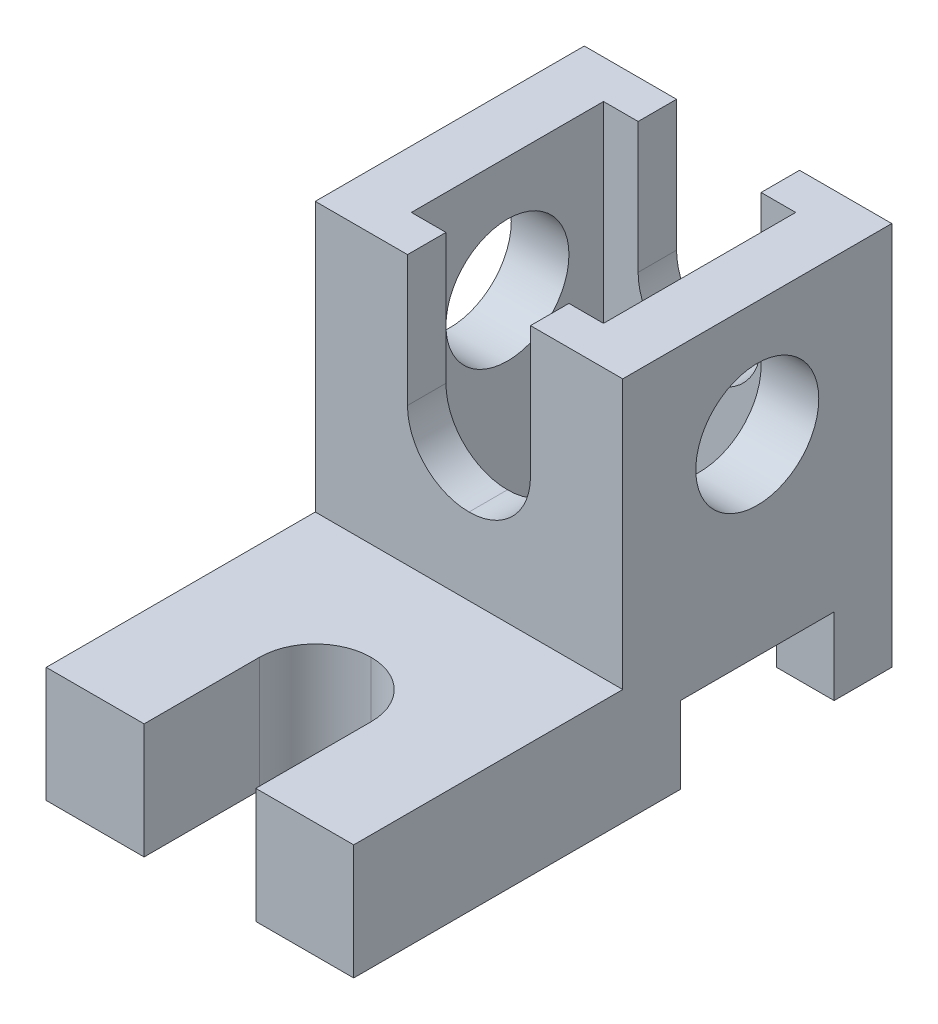
ISO-10303-21;
HEADER;
FILE_DESCRIPTION(('STEP AP214'),'2;1');
FILE_NAME('part.step','',(''),(''),'','','');
FILE_SCHEMA(('AUTOMOTIVE_DESIGN { 1 0 10303 214 1 1 1 1 }'));
ENDSEC;
DATA;
#1=APPLICATION_CONTEXT('core data for automotive mechanical design processes');
#2=APPLICATION_PROTOCOL_DEFINITION('international standard','automotive_design',2000,#1);
#3=PRODUCT_CONTEXT('',#1,'mechanical');
#4=PRODUCT('Part','Part','',(#3));
#5=PRODUCT_RELATED_PRODUCT_CATEGORY('part','',(#4));
#6=PRODUCT_DEFINITION_FORMATION('','',#4);
#7=PRODUCT_DEFINITION_CONTEXT('part definition',#1,'design');
#8=PRODUCT_DEFINITION('design','',#6,#7);
#9=PRODUCT_DEFINITION_SHAPE('','',#8);
#10=(LENGTH_UNIT() NAMED_UNIT(*) SI_UNIT(.MILLI.,.METRE.));
#11=(NAMED_UNIT(*) PLANE_ANGLE_UNIT() SI_UNIT($,.RADIAN.));
#12=(NAMED_UNIT(*) SI_UNIT($,.STERADIAN.) SOLID_ANGLE_UNIT());
#13=UNCERTAINTY_MEASURE_WITH_UNIT(LENGTH_MEASURE(1.E-05),#10,'distance_accuracy_value','');
#14=(GEOMETRIC_REPRESENTATION_CONTEXT(3) GLOBAL_UNCERTAINTY_ASSIGNED_CONTEXT((#13)) GLOBAL_UNIT_ASSIGNED_CONTEXT((#10,
#11,#12)) REPRESENTATION_CONTEXT('',''));
#15=CARTESIAN_POINT('',(0.,0.,0.));
#16=DIRECTION('',(0.,0.,1.));
#17=DIRECTION('',(1.,0.,0.));
#18=AXIS2_PLACEMENT_3D('',#15,#16,#17);
#19=CARTESIAN_POINT('',(-40.,30.,105.));
#20=DIRECTION('',(0.,0.,1.));
#21=DIRECTION('',(1.,0.,0.));
#22=AXIS2_PLACEMENT_3D('',#19,#20,#21);
#23=PLANE('',#22);
#24=DIRECTION('',(0.,1.,0.));
#25=VECTOR('',#24,1.);
#26=CARTESIAN_POINT('',(-14.53,0.,105.));
#27=LINE('',#26,#25);
#28=CARTESIAN_POINT('',(-14.53,0.,105.));
#29=VERTEX_POINT('',#28);
#30=CARTESIAN_POINT('',(-14.53,30.,105.));
#31=VERTEX_POINT('',#30);
#32=EDGE_CURVE('E273',#29,#31,#27,.T.);
#33=ORIENTED_EDGE('',*,*,#32,.T.);
#34=DIRECTION('',(1.,0.,0.));
#35=VECTOR('',#34,1.);
#36=CARTESIAN_POINT('',(-40.,30.,105.));
#37=LINE('',#36,#35);
#38=CARTESIAN_POINT('',(-40.,30.,105.));
#39=VERTEX_POINT('',#38);
#40=EDGE_CURVE('E312',#39,#31,#37,.T.);
#41=ORIENTED_EDGE('',*,*,#40,.F.);
#42=DIRECTION('',(0.,-1.,0.));
#43=VECTOR('',#42,1.);
#44=CARTESIAN_POINT('',(-40.,30.,105.));
#45=LINE('',#44,#43);
#46=CARTESIAN_POINT('',(-40.,0.,105.));
#47=VERTEX_POINT('',#46);
#48=EDGE_CURVE('E283',#39,#47,#45,.T.);
#49=ORIENTED_EDGE('',*,*,#48,.T.);
#50=DIRECTION('',(1.,0.,0.));
#51=VECTOR('',#50,1.);
#52=CARTESIAN_POINT('',(-40.,0.,105.));
#53=LINE('',#52,#51);
#54=EDGE_CURVE('E264',#47,#29,#53,.T.);
#55=ORIENTED_EDGE('',*,*,#54,.T.);
#56=EDGE_LOOP('',(#33,#41,#49,#55));
#57=FACE_BOUND('',#56,.T.);
#58=ADVANCED_FACE('F45',(#57),#23,.T.);
#59=CARTESIAN_POINT('',(-40.,100.,-35.));
#60=DIRECTION('',(0.,1.,0.));
#61=DIRECTION('',(0.,0.,1.));
#62=AXIS2_PLACEMENT_3D('',#59,#60,#61);
#63=PLANE('',#62);
#64=DIRECTION('',(0.,0.,1.));
#65=VECTOR('',#64,1.);
#66=CARTESIAN_POINT('',(-16.,100.,-35.));
#67=LINE('',#66,#65);
#68=CARTESIAN_POINT('',(-16.,100.,-35.));
#69=VERTEX_POINT('',#68);
#70=CARTESIAN_POINT('',(-16.,100.,-25.));
#71=VERTEX_POINT('',#70);
#72=EDGE_CURVE('E586',#69,#71,#67,.T.);
#73=ORIENTED_EDGE('',*,*,#72,.F.);
#74=DIRECTION('',(1.,0.,0.));
#75=VECTOR('',#74,1.);
#76=CARTESIAN_POINT('',(-40.,100.,-35.));
#77=LINE('',#76,#75);
#78=CARTESIAN_POINT('',(-40.,100.,-35.));
#79=VERTEX_POINT('',#78);
#80=EDGE_CURVE('E389',#79,#69,#77,.T.);
#81=ORIENTED_EDGE('',*,*,#80,.F.);
#82=DIRECTION('',(0.,0.,1.));
#83=VECTOR('',#82,1.);
#84=CARTESIAN_POINT('',(-40.,100.,-35.));
#85=LINE('',#84,#83);
#86=CARTESIAN_POINT('',(-40.,100.,35.));
#87=VERTEX_POINT('',#86);
#88=EDGE_CURVE('E452',#79,#87,#85,.T.);
#89=ORIENTED_EDGE('',*,*,#88,.T.);
#90=DIRECTION('',(1.,0.,0.));
#91=VECTOR('',#90,1.);
#92=CARTESIAN_POINT('',(-40.,100.,35.));
#93=LINE('',#92,#91);
#94=CARTESIAN_POINT('',(-16.,100.,35.));
#95=VERTEX_POINT('',#94);
#96=EDGE_CURVE('E382',#87,#95,#93,.T.);
#97=ORIENTED_EDGE('',*,*,#96,.T.);
#98=CARTESIAN_POINT('',(-16.,100.,25.));
#99=VERTEX_POINT('',#98);
#100=EDGE_CURVE('E591',#99,#95,#67,.T.);
#101=ORIENTED_EDGE('',*,*,#100,.F.);
#102=DIRECTION('',(1.,0.,0.));
#103=VECTOR('',#102,1.);
#104=CARTESIAN_POINT('',(-25.,100.,25.));
#105=LINE('',#104,#103);
#106=CARTESIAN_POINT('',(-25.,100.,25.));
#107=VERTEX_POINT('',#106);
#108=EDGE_CURVE('E547',#107,#99,#105,.T.);
#109=ORIENTED_EDGE('',*,*,#108,.F.);
#110=DIRECTION('',(0.,0.,1.));
#111=VECTOR('',#110,1.);
#112=CARTESIAN_POINT('',(-25.,100.,-25.));
#113=LINE('',#112,#111);
#114=CARTESIAN_POINT('',(-25.,100.,-25.));
#115=VERTEX_POINT('',#114);
#116=EDGE_CURVE('E553',#115,#107,#113,.T.);
#117=ORIENTED_EDGE('',*,*,#116,.F.);
#118=DIRECTION('',(-1.,0.,0.));
#119=VECTOR('',#118,1.);
#120=CARTESIAN_POINT('',(-25.,100.,-25.));
#121=LINE('',#120,#119);
#122=EDGE_CURVE('E561',#71,#115,#121,.T.);
#123=ORIENTED_EDGE('',*,*,#122,.F.);
#124=EDGE_LOOP('',(#73,#81,#89,#97,#101,#109,#117,#123));
#125=FACE_BOUND('',#124,.T.);
#126=ADVANCED_FACE('F641',(#125),#63,.T.);
#127=CARTESIAN_POINT('',(-40.,20.,-20.));
#128=DIRECTION('',(0.,0.,1.));
#129=DIRECTION('',(1.,0.,0.));
#130=AXIS2_PLACEMENT_3D('',#127,#128,#129);
#131=PLANE('',#130);
#132=DIRECTION('',(0.,1.,0.));
#133=VECTOR('',#132,1.);
#134=CARTESIAN_POINT('',(25.,20.,-20.));
#135=LINE('',#134,#133);
#136=CARTESIAN_POINT('',(25.,0.,-20.));
#137=VERTEX_POINT('',#136);
#138=CARTESIAN_POINT('',(25.,20.,-20.));
#139=VERTEX_POINT('',#138);
#140=EDGE_CURVE('E517',#137,#139,#135,.T.);
#141=ORIENTED_EDGE('',*,*,#140,.F.);
#142=DIRECTION('',(1.,0.,0.));
#143=VECTOR('',#142,1.);
#144=CARTESIAN_POINT('',(-40.,0.,-20.));
#145=LINE('',#144,#143);
#146=CARTESIAN_POINT('',(40.,0.,-20.));
#147=VERTEX_POINT('',#146);
#148=EDGE_CURVE('E401',#137,#147,#145,.T.);
#149=ORIENTED_EDGE('',*,*,#148,.T.);
#150=DIRECTION('',(0.,-1.,0.));
#151=VECTOR('',#150,1.);
#152=CARTESIAN_POINT('',(40.,20.,-20.));
#153=LINE('',#152,#151);
#154=CARTESIAN_POINT('',(40.,20.,-20.));
#155=VERTEX_POINT('',#154);
#156=EDGE_CURVE('E493',#155,#147,#153,.T.);
#157=ORIENTED_EDGE('',*,*,#156,.F.);
#158=DIRECTION('',(1.,0.,0.));
#159=VECTOR('',#158,1.);
#160=CARTESIAN_POINT('',(-40.,20.,-20.));
#161=LINE('',#160,#159);
#162=EDGE_CURVE('E407',#139,#155,#161,.T.);
#163=ORIENTED_EDGE('',*,*,#162,.F.);
#164=EDGE_LOOP('',(#141,#149,#157,#163));
#165=FACE_BOUND('',#164,.T.);
#166=ADVANCED_FACE('F658',(#165),#131,.T.);
#167=CARTESIAN_POINT('',(-40.,20.,20.));
#168=DIRECTION('',(0.,-1.,0.));
#169=DIRECTION('',(0.,0.,-1.));
#170=AXIS2_PLACEMENT_3D('',#167,#168,#169);
#171=PLANE('',#170);
#172=DIRECTION('',(0.,0.,1.));
#173=VECTOR('',#172,1.);
#174=CARTESIAN_POINT('',(25.,20.,20.));
#175=LINE('',#174,#173);
#176=CARTESIAN_POINT('',(25.,20.,20.));
#177=VERTEX_POINT('',#176);
#178=EDGE_CURVE('E520',#139,#177,#175,.T.);
#179=ORIENTED_EDGE('',*,*,#178,.F.);
#180=ORIENTED_EDGE('',*,*,#162,.T.);
#181=DIRECTION('',(0.,0.,-1.));
#182=VECTOR('',#181,1.);
#183=CARTESIAN_POINT('',(40.,20.,20.));
#184=LINE('',#183,#182);
#185=CARTESIAN_POINT('',(40.,20.,20.));
#186=VERTEX_POINT('',#185);
#187=EDGE_CURVE('E497',#186,#155,#184,.T.);
#188=ORIENTED_EDGE('',*,*,#187,.F.);
#189=DIRECTION('',(1.,0.,0.));
#190=VECTOR('',#189,1.);
#191=CARTESIAN_POINT('',(-40.,20.,20.));
#192=LINE('',#191,#190);
#193=EDGE_CURVE('E413',#177,#186,#192,.T.);
#194=ORIENTED_EDGE('',*,*,#193,.F.);
#195=EDGE_LOOP('',(#179,#180,#188,#194));
#196=FACE_BOUND('',#195,.T.);
#197=ADVANCED_FACE('F725',(#196),#171,.T.);
#198=CARTESIAN_POINT('',(-40.,0.,20.));
#199=DIRECTION('',(0.,0.,-1.));
#200=DIRECTION('',(-1.,0.,0.));
#201=AXIS2_PLACEMENT_3D('',#198,#199,#200);
#202=PLANE('',#201);
#203=DIRECTION('',(0.,-1.,0.));
#204=VECTOR('',#203,1.);
#205=CARTESIAN_POINT('',(25.,0.,20.));
#206=LINE('',#205,#204);
#207=CARTESIAN_POINT('',(25.,0.,20.));
#208=VERTEX_POINT('',#207);
#209=EDGE_CURVE('E305',#177,#208,#206,.T.);
#210=ORIENTED_EDGE('',*,*,#209,.F.);
#211=ORIENTED_EDGE('',*,*,#193,.T.);
#212=DIRECTION('',(0.,1.,0.));
#213=VECTOR('',#212,1.);
#214=CARTESIAN_POINT('',(40.,0.,20.));
#215=LINE('',#214,#213);
#216=CARTESIAN_POINT('',(40.,0.,20.));
#217=VERTEX_POINT('',#216);
#218=EDGE_CURVE('E501',#217,#186,#215,.T.);
#219=ORIENTED_EDGE('',*,*,#218,.F.);
#220=DIRECTION('',(1.,0.,0.));
#221=VECTOR('',#220,1.);
#222=CARTESIAN_POINT('',(-40.,0.,20.));
#223=LINE('',#222,#221);
#224=EDGE_CURVE('E285',#208,#217,#223,.T.);
#225=ORIENTED_EDGE('',*,*,#224,.F.);
#226=EDGE_LOOP('',(#210,#211,#219,#225));
#227=FACE_BOUND('',#226,.T.);
#228=ADVANCED_FACE('F717',(#227),#202,.T.);
#229=CARTESIAN_POINT('',(-40.,70.,0.));
#230=DIRECTION('',(1.,0.,0.));
#231=DIRECTION('',(0.,0.,-1.));
#232=AXIS2_PLACEMENT_3D('',#229,#230,#231);
#233=CYLINDRICAL_SURFACE('',#232,16.);
#234=CARTESIAN_POINT('',(25.,70.,0.));
#235=DIRECTION('',(1.,0.,0.));
#236=DIRECTION('',(0.,0.,-1.));
#237=AXIS2_PLACEMENT_3D('',#234,#235,#236);
#238=CIRCLE('',#237,16.);
#239=CARTESIAN_POINT('',(25.,70.,-16.));
#240=VERTEX_POINT('',#239);
#241=EDGE_CURVE('E301',#240,#240,#238,.F.);
#242=ORIENTED_EDGE('',*,*,#241,.T.);
#243=EDGE_LOOP('',(#242));
#244=FACE_BOUND('',#243,.T.);
#245=CARTESIAN_POINT('',(40.,70.,0.));
#246=DIRECTION('',(1.,0.,0.));
#247=DIRECTION('',(0.,0.,-1.));
#248=AXIS2_PLACEMENT_3D('',#245,#246,#247);
#249=CIRCLE('',#248,16.);
#250=CARTESIAN_POINT('',(40.,70.,-16.));
#251=VERTEX_POINT('',#250);
#252=EDGE_CURVE('E513',#251,#251,#249,.T.);
#253=ORIENTED_EDGE('',*,*,#252,.T.);
#254=EDGE_LOOP('',(#253));
#255=FACE_BOUND('',#254,.T.);
#256=ADVANCED_FACE('F711',(#244,#255),#233,.F.);
#257=DIRECTION('',(0.,1.,0.));
#258=VECTOR('',#257,1.);
#259=CARTESIAN_POINT('',(14.53,0.,105.));
#260=LINE('',#259,#258);
#261=CARTESIAN_POINT('',(14.53,0.,105.));
#262=VERTEX_POINT('',#261);
#263=CARTESIAN_POINT('',(14.53,30.,105.));
#264=VERTEX_POINT('',#263);
#265=EDGE_CURVE('E279',#262,#264,#260,.T.);
#266=ORIENTED_EDGE('',*,*,#265,.F.);
#267=CARTESIAN_POINT('',(40.,0.,105.));
#268=VERTEX_POINT('',#267);
#269=EDGE_CURVE('E286',#262,#268,#53,.T.);
#270=ORIENTED_EDGE('',*,*,#269,.T.);
#271=DIRECTION('',(0.,-1.,0.));
#272=VECTOR('',#271,1.);
#273=CARTESIAN_POINT('',(40.,30.,105.));
#274=LINE('',#273,#272);
#275=CARTESIAN_POINT('',(40.,30.,105.));
#276=VERTEX_POINT('',#275);
#277=EDGE_CURVE('E509',#276,#268,#274,.T.);
#278=ORIENTED_EDGE('',*,*,#277,.F.);
#279=EDGE_CURVE('E377',#264,#276,#37,.T.);
#280=ORIENTED_EDGE('',*,*,#279,.F.);
#281=EDGE_LOOP('',(#266,#270,#278,#280));
#282=FACE_BOUND('',#281,.T.);
#283=ADVANCED_FACE('F626',(#282),#23,.T.);
#284=CARTESIAN_POINT('',(-40.,30.,35.));
#285=DIRECTION('',(0.,1.,0.));
#286=DIRECTION('',(0.,0.,1.));
#287=AXIS2_PLACEMENT_3D('',#284,#285,#286);
#288=PLANE('',#287);
#289=DIRECTION('',(0.,0.,1.));
#290=VECTOR('',#289,1.);
#291=CARTESIAN_POINT('',(-14.53,30.,105.));
#292=LINE('',#291,#290);
#293=CARTESIAN_POINT('',(-14.53,30.,75.));
#294=VERTEX_POINT('',#293);
#295=EDGE_CURVE('E275',#294,#31,#292,.T.);
#296=ORIENTED_EDGE('',*,*,#295,.F.);
#297=CARTESIAN_POINT('',(0.,30.,75.));
#298=DIRECTION('',(0.,1.,0.));
#299=DIRECTION('',(0.,0.,1.));
#300=AXIS2_PLACEMENT_3D('',#297,#298,#299);
#301=CIRCLE('',#300,14.53);
#302=CARTESIAN_POINT('',(0.,30.,60.47));
#303=VERTEX_POINT('',#302);
#304=EDGE_CURVE('E55',#294,#303,#301,.F.);
#305=ORIENTED_EDGE('',*,*,#304,.T.);
#306=CARTESIAN_POINT('',(0.,30.,75.));
#307=DIRECTION('',(0.,1.,0.));
#308=DIRECTION('',(0.,0.,1.));
#309=AXIS2_PLACEMENT_3D('',#306,#307,#308);
#310=CIRCLE('',#309,14.53);
#311=CARTESIAN_POINT('',(14.53,30.,75.));
#312=VERTEX_POINT('',#311);
#313=EDGE_CURVE('E369',#303,#312,#310,.F.);
#314=ORIENTED_EDGE('',*,*,#313,.T.);
#315=DIRECTION('',(0.,0.,-1.));
#316=VECTOR('',#315,1.);
#317=CARTESIAN_POINT('',(14.53,30.,105.));
#318=LINE('',#317,#316);
#319=EDGE_CURVE('E270',#264,#312,#318,.T.);
#320=ORIENTED_EDGE('',*,*,#319,.F.);
#321=ORIENTED_EDGE('',*,*,#279,.T.);
#322=DIRECTION('',(0.,0.,1.));
#323=VECTOR('',#322,1.);
#324=CARTESIAN_POINT('',(40.,30.,35.));
#325=LINE('',#324,#323);
#326=CARTESIAN_POINT('',(40.,30.,35.));
#327=VERTEX_POINT('',#326);
#328=EDGE_CURVE('E471',#327,#276,#325,.T.);
#329=ORIENTED_EDGE('',*,*,#328,.F.);
#330=DIRECTION('',(1.,0.,0.));
#331=VECTOR('',#330,1.);
#332=CARTESIAN_POINT('',(-40.,30.,35.));
#333=LINE('',#332,#331);
#334=CARTESIAN_POINT('',(-40.,30.,35.));
#335=VERTEX_POINT('',#334);
#336=EDGE_CURVE('E380',#335,#327,#333,.T.);
#337=ORIENTED_EDGE('',*,*,#336,.F.);
#338=DIRECTION('',(0.,0.,1.));
#339=VECTOR('',#338,1.);
#340=CARTESIAN_POINT('',(-40.,30.,35.));
#341=LINE('',#340,#339);
#342=EDGE_CURVE('E292',#335,#39,#341,.T.);
#343=ORIENTED_EDGE('',*,*,#342,.T.);
#344=ORIENTED_EDGE('',*,*,#40,.T.);
#345=EDGE_LOOP('',(#296,#305,#314,#320,#321,#329,#337,#343,#344));
#346=FACE_BOUND('',#345,.T.);
#347=ADVANCED_FACE('F463',(#346),#288,.T.);
#348=CARTESIAN_POINT('',(-40.,100.,35.));
#349=DIRECTION('',(0.,0.,1.));
#350=DIRECTION('',(0.,-1.,0.));
#351=AXIS2_PLACEMENT_3D('',#348,#349,#350);
#352=PLANE('',#351);
#353=DIRECTION('',(0.,-1.,0.));
#354=VECTOR('',#353,1.);
#355=CARTESIAN_POINT('',(-16.,100.,35.));
#356=LINE('',#355,#354);
#357=CARTESIAN_POINT('',(-16.,66.,35.));
#358=VERTEX_POINT('',#357);
#359=EDGE_CURVE('E358',#95,#358,#356,.T.);
#360=ORIENTED_EDGE('',*,*,#359,.F.);
#361=ORIENTED_EDGE('',*,*,#96,.F.);
#362=DIRECTION('',(0.,-1.,0.));
#363=VECTOR('',#362,1.);
#364=CARTESIAN_POINT('',(-40.,100.,35.));
#365=LINE('',#364,#363);
#366=EDGE_CURVE('E456',#87,#335,#365,.T.);
#367=ORIENTED_EDGE('',*,*,#366,.T.);
#368=ORIENTED_EDGE('',*,*,#336,.T.);
#369=DIRECTION('',(0.,-1.,0.));
#370=VECTOR('',#369,1.);
#371=CARTESIAN_POINT('',(40.,100.,35.));
#372=LINE('',#371,#370);
#373=CARTESIAN_POINT('',(40.,100.,35.));
#374=VERTEX_POINT('',#373);
#375=EDGE_CURVE('E477',#374,#327,#372,.T.);
#376=ORIENTED_EDGE('',*,*,#375,.F.);
#377=CARTESIAN_POINT('',(16.,100.,35.));
#378=VERTEX_POINT('',#377);
#379=EDGE_CURVE('E386',#378,#374,#93,.T.);
#380=ORIENTED_EDGE('',*,*,#379,.F.);
#381=DIRECTION('',(0.,1.,0.));
#382=VECTOR('',#381,1.);
#383=CARTESIAN_POINT('',(16.,100.,35.));
#384=LINE('',#383,#382);
#385=CARTESIAN_POINT('',(16.,66.,35.));
#386=VERTEX_POINT('',#385);
#387=EDGE_CURVE('E596',#386,#378,#384,.T.);
#388=ORIENTED_EDGE('',*,*,#387,.F.);
#389=CARTESIAN_POINT('',(0.,66.,35.));
#390=DIRECTION('',(0.,0.,1.));
#391=DIRECTION('',(0.,-1.,0.));
#392=AXIS2_PLACEMENT_3D('',#389,#390,#391);
#393=CIRCLE('',#392,16.);
#394=CARTESIAN_POINT('',(0.,50.,35.));
#395=VERTEX_POINT('',#394);
#396=EDGE_CURVE('E341',#386,#395,#393,.F.);
#397=ORIENTED_EDGE('',*,*,#396,.T.);
#398=CARTESIAN_POINT('',(0.,66.,35.));
#399=DIRECTION('',(0.,0.,1.));
#400=DIRECTION('',(0.,-1.,0.));
#401=AXIS2_PLACEMENT_3D('',#398,#399,#400);
#402=CIRCLE('',#401,16.);
#403=EDGE_CURVE('E347',#395,#358,#402,.F.);
#404=ORIENTED_EDGE('',*,*,#403,.T.);
#405=EDGE_LOOP('',(#360,#361,#367,#368,#376,#380,#388,#397,#404));
#406=FACE_BOUND('',#405,.T.);
#407=ADVANCED_FACE('F636',(#406),#352,.T.);
#408=DIRECTION('',(0.,0.,1.));
#409=VECTOR('',#408,1.);
#410=CARTESIAN_POINT('',(16.,100.,-35.));
#411=LINE('',#410,#409);
#412=CARTESIAN_POINT('',(16.,100.,25.));
#413=VERTEX_POINT('',#412);
#414=EDGE_CURVE('E592',#413,#378,#411,.T.);
#415=ORIENTED_EDGE('',*,*,#414,.T.);
#416=ORIENTED_EDGE('',*,*,#379,.T.);
#417=DIRECTION('',(0.,0.,1.));
#418=VECTOR('',#417,1.);
#419=CARTESIAN_POINT('',(40.,100.,-35.));
#420=LINE('',#419,#418);
#421=CARTESIAN_POINT('',(40.,100.,-35.));
#422=VERTEX_POINT('',#421);
#423=EDGE_CURVE('E481',#422,#374,#420,.T.);
#424=ORIENTED_EDGE('',*,*,#423,.F.);
#425=CARTESIAN_POINT('',(16.,100.,-35.));
#426=VERTEX_POINT('',#425);
#427=EDGE_CURVE('E392',#426,#422,#77,.T.);
#428=ORIENTED_EDGE('',*,*,#427,.F.);
#429=CARTESIAN_POINT('',(16.,100.,-25.));
#430=VERTEX_POINT('',#429);
#431=EDGE_CURVE('E587',#426,#430,#411,.T.);
#432=ORIENTED_EDGE('',*,*,#431,.T.);
#433=CARTESIAN_POINT('',(25.,100.,-25.));
#434=VERTEX_POINT('',#433);
#435=EDGE_CURVE('E557',#434,#430,#121,.T.);
#436=ORIENTED_EDGE('',*,*,#435,.F.);
#437=DIRECTION('',(0.,0.,-1.));
#438=VECTOR('',#437,1.);
#439=CARTESIAN_POINT('',(25.,100.,-25.));
#440=LINE('',#439,#438);
#441=CARTESIAN_POINT('',(25.,100.,25.));
#442=VERTEX_POINT('',#441);
#443=EDGE_CURVE('E562',#442,#434,#440,.T.);
#444=ORIENTED_EDGE('',*,*,#443,.F.);
#445=EDGE_CURVE('E552',#413,#442,#105,.T.);
#446=ORIENTED_EDGE('',*,*,#445,.F.);
#447=EDGE_LOOP('',(#415,#416,#424,#428,#432,#436,#444,#446));
#448=FACE_BOUND('',#447,.T.);
#449=ADVANCED_FACE('F670',(#448),#63,.T.);
#450=CARTESIAN_POINT('',(-40.,0.,-35.));
#451=DIRECTION('',(0.,0.,-1.));
#452=DIRECTION('',(-1.,0.,0.));
#453=AXIS2_PLACEMENT_3D('',#450,#451,#452);
#454=PLANE('',#453);
#455=DIRECTION('',(0.,-1.,0.));
#456=VECTOR('',#455,1.);
#457=CARTESIAN_POINT('',(-16.,100.,-35.));
#458=LINE('',#457,#456);
#459=CARTESIAN_POINT('',(-16.,66.,-35.));
#460=VERTEX_POINT('',#459);
#461=EDGE_CURVE('E599',#69,#460,#458,.T.);
#462=ORIENTED_EDGE('',*,*,#461,.T.);
#463=CARTESIAN_POINT('',(0.,66.,-35.));
#464=DIRECTION('',(0.,0.,-1.));
#465=DIRECTION('',(-1.,0.,0.));
#466=AXIS2_PLACEMENT_3D('',#463,#464,#465);
#467=CIRCLE('',#466,16.);
#468=CARTESIAN_POINT('',(0.,50.,-35.));
#469=VERTEX_POINT('',#468);
#470=EDGE_CURVE('E332',#460,#469,#467,.F.);
#471=ORIENTED_EDGE('',*,*,#470,.T.);
#472=CARTESIAN_POINT('',(0.,66.,-35.));
#473=DIRECTION('',(0.,0.,-1.));
#474=DIRECTION('',(-1.,0.,0.));
#475=AXIS2_PLACEMENT_3D('',#472,#473,#474);
#476=CIRCLE('',#475,16.);
#477=CARTESIAN_POINT('',(16.,66.,-35.));
#478=VERTEX_POINT('',#477);
#479=EDGE_CURVE('E338',#469,#478,#476,.F.);
#480=ORIENTED_EDGE('',*,*,#479,.T.);
#481=DIRECTION('',(0.,1.,0.));
#482=VECTOR('',#481,1.);
#483=CARTESIAN_POINT('',(16.,100.,-35.));
#484=LINE('',#483,#482);
#485=EDGE_CURVE('E603',#478,#426,#484,.T.);
#486=ORIENTED_EDGE('',*,*,#485,.T.);
#487=ORIENTED_EDGE('',*,*,#427,.T.);
#488=DIRECTION('',(0.,1.,0.));
#489=VECTOR('',#488,1.);
#490=CARTESIAN_POINT('',(40.,0.,-35.));
#491=LINE('',#490,#489);
#492=CARTESIAN_POINT('',(40.,0.,-35.));
#493=VERTEX_POINT('',#492);
#494=EDGE_CURVE('E485',#493,#422,#491,.T.);
#495=ORIENTED_EDGE('',*,*,#494,.F.);
#496=DIRECTION('',(1.,0.,0.));
#497=VECTOR('',#496,1.);
#498=CARTESIAN_POINT('',(-40.,0.,-35.));
#499=LINE('',#498,#497);
#500=CARTESIAN_POINT('',(-40.,0.,-35.));
#501=VERTEX_POINT('',#500);
#502=EDGE_CURVE('E395',#501,#493,#499,.T.);
#503=ORIENTED_EDGE('',*,*,#502,.F.);
#504=DIRECTION('',(0.,1.,0.));
#505=VECTOR('',#504,1.);
#506=CARTESIAN_POINT('',(-40.,0.,-35.));
#507=LINE('',#506,#505);
#508=EDGE_CURVE('E448',#501,#79,#507,.T.);
#509=ORIENTED_EDGE('',*,*,#508,.T.);
#510=ORIENTED_EDGE('',*,*,#80,.T.);
#511=EDGE_LOOP('',(#462,#471,#480,#486,#487,#495,#503,#509,#510));
#512=FACE_BOUND('',#511,.T.);
#513=ADVANCED_FACE('F646',(#512),#454,.T.);
#514=CARTESIAN_POINT('',(-40.,0.,-20.));
#515=DIRECTION('',(0.,-1.,0.));
#516=DIRECTION('',(0.,0.,-1.));
#517=AXIS2_PLACEMENT_3D('',#514,#515,#516);
#518=PLANE('',#517);
#519=DIRECTION('',(0.,0.,-1.));
#520=VECTOR('',#519,1.);
#521=CARTESIAN_POINT('',(25.,0.,-25.));
#522=LINE('',#521,#520);
#523=CARTESIAN_POINT('',(25.,0.,-25.));
#524=VERTEX_POINT('',#523);
#525=EDGE_CURVE('E551',#137,#524,#522,.T.);
#526=ORIENTED_EDGE('',*,*,#525,.T.);
#527=DIRECTION('',(-1.,0.,0.));
#528=VECTOR('',#527,1.);
#529=CARTESIAN_POINT('',(-25.,0.,-25.));
#530=LINE('',#529,#528);
#531=CARTESIAN_POINT('',(-25.,0.,-25.));
#532=VERTEX_POINT('',#531);
#533=EDGE_CURVE('E572',#524,#532,#530,.T.);
#534=ORIENTED_EDGE('',*,*,#533,.T.);
#535=DIRECTION('',(0.,0.,1.));
#536=VECTOR('',#535,1.);
#537=CARTESIAN_POINT('',(-25.,0.,-25.));
#538=LINE('',#537,#536);
#539=CARTESIAN_POINT('',(-25.,0.,-20.));
#540=VERTEX_POINT('',#539);
#541=EDGE_CURVE('E568',#532,#540,#538,.T.);
#542=ORIENTED_EDGE('',*,*,#541,.T.);
#543=CARTESIAN_POINT('',(-40.,0.,-20.));
#544=VERTEX_POINT('',#543);
#545=EDGE_CURVE('E397',#544,#540,#145,.T.);
#546=ORIENTED_EDGE('',*,*,#545,.F.);
#547=DIRECTION('',(0.,0.,-1.));
#548=VECTOR('',#547,1.);
#549=CARTESIAN_POINT('',(-40.,0.,-20.));
#550=LINE('',#549,#548);
#551=EDGE_CURVE('E444',#544,#501,#550,.T.);
#552=ORIENTED_EDGE('',*,*,#551,.T.);
#553=ORIENTED_EDGE('',*,*,#502,.T.);
#554=DIRECTION('',(0.,0.,-1.));
#555=VECTOR('',#554,1.);
#556=CARTESIAN_POINT('',(40.,0.,-20.));
#557=LINE('',#556,#555);
#558=EDGE_CURVE('E489',#147,#493,#557,.T.);
#559=ORIENTED_EDGE('',*,*,#558,.F.);
#560=ORIENTED_EDGE('',*,*,#148,.F.);
#561=EDGE_LOOP('',(#526,#534,#542,#546,#552,#553,#559,#560));
#562=FACE_BOUND('',#561,.T.);
#563=ADVANCED_FACE('F651',(#562),#518,.T.);
#564=DIRECTION('',(0.,-1.,0.));
#565=VECTOR('',#564,1.);
#566=CARTESIAN_POINT('',(-25.,20.,-20.));
#567=LINE('',#566,#565);
#568=CARTESIAN_POINT('',(-25.,20.,-20.));
#569=VERTEX_POINT('',#568);
#570=EDGE_CURVE('E306',#569,#540,#567,.T.);
#571=ORIENTED_EDGE('',*,*,#570,.F.);
#572=CARTESIAN_POINT('',(-40.,20.,-20.));
#573=VERTEX_POINT('',#572);
#574=EDGE_CURVE('E404',#573,#569,#161,.T.);
#575=ORIENTED_EDGE('',*,*,#574,.F.);
#576=DIRECTION('',(0.,-1.,0.));
#577=VECTOR('',#576,1.);
#578=CARTESIAN_POINT('',(-40.,20.,-20.));
#579=LINE('',#578,#577);
#580=EDGE_CURVE('E436',#573,#544,#579,.T.);
#581=ORIENTED_EDGE('',*,*,#580,.T.);
#582=ORIENTED_EDGE('',*,*,#545,.T.);
#583=EDGE_LOOP('',(#571,#575,#581,#582));
#584=FACE_BOUND('',#583,.T.);
#585=ADVANCED_FACE('F779',(#584),#131,.T.);
#586=DIRECTION('',(0.,0.,-1.));
#587=VECTOR('',#586,1.);
#588=CARTESIAN_POINT('',(-25.,20.,20.));
#589=LINE('',#588,#587);
#590=CARTESIAN_POINT('',(-25.,20.,20.));
#591=VERTEX_POINT('',#590);
#592=EDGE_CURVE('E527',#591,#569,#589,.T.);
#593=ORIENTED_EDGE('',*,*,#592,.F.);
#594=CARTESIAN_POINT('',(-40.,20.,20.));
#595=VERTEX_POINT('',#594);
#596=EDGE_CURVE('E410',#595,#591,#192,.T.);
#597=ORIENTED_EDGE('',*,*,#596,.F.);
#598=DIRECTION('',(0.,0.,-1.));
#599=VECTOR('',#598,1.);
#600=CARTESIAN_POINT('',(-40.,20.,20.));
#601=LINE('',#600,#599);
#602=EDGE_CURVE('E431',#595,#573,#601,.T.);
#603=ORIENTED_EDGE('',*,*,#602,.T.);
#604=ORIENTED_EDGE('',*,*,#574,.T.);
#605=EDGE_LOOP('',(#593,#597,#603,#604));
#606=FACE_BOUND('',#605,.T.);
#607=ADVANCED_FACE('F782',(#606),#171,.T.);
#608=DIRECTION('',(0.,1.,0.));
#609=VECTOR('',#608,1.);
#610=CARTESIAN_POINT('',(-25.,0.,20.));
#611=LINE('',#610,#609);
#612=CARTESIAN_POINT('',(-25.,0.,20.));
#613=VERTEX_POINT('',#612);
#614=EDGE_CURVE('E299',#613,#591,#611,.T.);
#615=ORIENTED_EDGE('',*,*,#614,.F.);
#616=CARTESIAN_POINT('',(-40.,0.,20.));
#617=VERTEX_POINT('',#616);
#618=EDGE_CURVE('E290',#617,#613,#223,.T.);
#619=ORIENTED_EDGE('',*,*,#618,.F.);
#620=DIRECTION('',(0.,1.,0.));
#621=VECTOR('',#620,1.);
#622=CARTESIAN_POINT('',(-40.,0.,20.));
#623=LINE('',#622,#621);
#624=EDGE_CURVE('E425',#617,#595,#623,.T.);
#625=ORIENTED_EDGE('',*,*,#624,.T.);
#626=ORIENTED_EDGE('',*,*,#596,.T.);
#627=EDGE_LOOP('',(#615,#619,#625,#626));
#628=FACE_BOUND('',#627,.T.);
#629=ADVANCED_FACE('F424',(#628),#202,.T.);
#630=CARTESIAN_POINT('',(-40.,0.,105.));
#631=DIRECTION('',(0.,-1.,0.));
#632=DIRECTION('',(0.,0.,-1.));
#633=AXIS2_PLACEMENT_3D('',#630,#631,#632);
#634=PLANE('',#633);
#635=CARTESIAN_POINT('',(0.,0.,75.));
#636=DIRECTION('',(0.,-1.,0.));
#637=DIRECTION('',(0.,0.,-1.));
#638=AXIS2_PLACEMENT_3D('',#635,#636,#637);
#639=CIRCLE('',#638,14.53);
#640=CARTESIAN_POINT('',(14.53,0.,75.));
#641=VERTEX_POINT('',#640);
#642=CARTESIAN_POINT('',(0.,0.,60.47));
#643=VERTEX_POINT('',#642);
#644=EDGE_CURVE('E61',#641,#643,#639,.F.);
#645=ORIENTED_EDGE('',*,*,#644,.T.);
#646=CARTESIAN_POINT('',(0.,0.,75.));
#647=DIRECTION('',(0.,-1.,0.));
#648=DIRECTION('',(0.,0.,-1.));
#649=AXIS2_PLACEMENT_3D('',#646,#647,#648);
#650=CIRCLE('',#649,14.53);
#651=CARTESIAN_POINT('',(-14.53,0.,75.));
#652=VERTEX_POINT('',#651);
#653=EDGE_CURVE('E11',#643,#652,#650,.F.);
#654=ORIENTED_EDGE('',*,*,#653,.T.);
#655=DIRECTION('',(0.,0.,1.));
#656=VECTOR('',#655,1.);
#657=CARTESIAN_POINT('',(-14.53,0.,105.));
#658=LINE('',#657,#656);
#659=EDGE_CURVE('E259',#652,#29,#658,.T.);
#660=ORIENTED_EDGE('',*,*,#659,.T.);
#661=ORIENTED_EDGE('',*,*,#54,.F.);
#662=DIRECTION('',(0.,0.,-1.));
#663=VECTOR('',#662,1.);
#664=CARTESIAN_POINT('',(-40.,0.,105.));
#665=LINE('',#664,#663);
#666=EDGE_CURVE('E419',#47,#617,#665,.T.);
#667=ORIENTED_EDGE('',*,*,#666,.T.);
#668=ORIENTED_EDGE('',*,*,#618,.T.);
#669=CARTESIAN_POINT('',(-25.,0.,25.));
#670=VERTEX_POINT('',#669);
#671=EDGE_CURVE('E418',#613,#670,#538,.T.);
#672=ORIENTED_EDGE('',*,*,#671,.T.);
#673=DIRECTION('',(1.,0.,0.));
#674=VECTOR('',#673,1.);
#675=CARTESIAN_POINT('',(-25.,0.,25.));
#676=LINE('',#675,#674);
#677=CARTESIAN_POINT('',(25.,0.,25.));
#678=VERTEX_POINT('',#677);
#679=EDGE_CURVE('E537',#670,#678,#676,.T.);
#680=ORIENTED_EDGE('',*,*,#679,.T.);
#681=EDGE_CURVE('E576',#678,#208,#522,.T.);
#682=ORIENTED_EDGE('',*,*,#681,.T.);
#683=ORIENTED_EDGE('',*,*,#224,.T.);
#684=DIRECTION('',(0.,0.,-1.));
#685=VECTOR('',#684,1.);
#686=CARTESIAN_POINT('',(40.,0.,105.));
#687=LINE('',#686,#685);
#688=EDGE_CURVE('E505',#268,#217,#687,.T.);
#689=ORIENTED_EDGE('',*,*,#688,.F.);
#690=ORIENTED_EDGE('',*,*,#269,.F.);
#691=DIRECTION('',(0.,0.,-1.));
#692=VECTOR('',#691,1.);
#693=CARTESIAN_POINT('',(14.53,0.,105.));
#694=LINE('',#693,#692);
#695=EDGE_CURVE('E269',#262,#641,#694,.T.);
#696=ORIENTED_EDGE('',*,*,#695,.T.);
#697=EDGE_LOOP('',(#645,#654,#660,#661,#667,#668,#672,#680,#682,#683,#689,#690,#696));
#698=FACE_BOUND('',#697,.T.);
#699=ADVANCED_FACE('F261',(#698),#634,.T.);
#700=CARTESIAN_POINT('',(-40.,0.,0.));
#701=DIRECTION('',(1.,0.,0.));
#702=DIRECTION('',(0.,0.,-1.));
#703=AXIS2_PLACEMENT_3D('',#700,#701,#702);
#704=PLANE('',#703);
#705=CARTESIAN_POINT('',(-40.,70.,0.));
#706=DIRECTION('',(1.,0.,0.));
#707=DIRECTION('',(0.,0.,-1.));
#708=AXIS2_PLACEMENT_3D('',#705,#706,#707);
#709=CIRCLE('',#708,16.);
#710=CARTESIAN_POINT('',(-40.,70.,-16.));
#711=VERTEX_POINT('',#710);
#712=EDGE_CURVE('E468',#711,#711,#709,.T.);
#713=ORIENTED_EDGE('',*,*,#712,.T.);
#714=EDGE_LOOP('',(#713));
#715=FACE_BOUND('',#714,.T.);
#716=ORIENTED_EDGE('',*,*,#48,.F.);
#717=ORIENTED_EDGE('',*,*,#342,.F.);
#718=ORIENTED_EDGE('',*,*,#366,.F.);
#719=ORIENTED_EDGE('',*,*,#88,.F.);
#720=ORIENTED_EDGE('',*,*,#508,.F.);
#721=ORIENTED_EDGE('',*,*,#551,.F.);
#722=ORIENTED_EDGE('',*,*,#580,.F.);
#723=ORIENTED_EDGE('',*,*,#602,.F.);
#724=ORIENTED_EDGE('',*,*,#624,.F.);
#725=ORIENTED_EDGE('',*,*,#666,.F.);
#726=EDGE_LOOP('',(#716,#717,#718,#719,#720,#721,#722,#723,#724,#725));
#727=FACE_BOUND('',#726,.T.);
#728=ADVANCED_FACE('F428',(#715,#727),#704,.F.);
#729=CARTESIAN_POINT('',(-25.,70.,0.));
#730=DIRECTION('',(-1.,0.,0.));
#731=DIRECTION('',(0.,0.,1.));
#732=AXIS2_PLACEMENT_3D('',#729,#730,#731);
#733=CIRCLE('',#732,16.);
#734=CARTESIAN_POINT('',(-25.,70.,16.));
#735=VERTEX_POINT('',#734);
#736=EDGE_CURVE('E295',#735,#735,#733,.F.);
#737=ORIENTED_EDGE('',*,*,#736,.T.);
#738=EDGE_LOOP('',(#737));
#739=FACE_BOUND('',#738,.T.);
#740=ORIENTED_EDGE('',*,*,#712,.F.);
#741=EDGE_LOOP('',(#740));
#742=FACE_BOUND('',#741,.T.);
#743=ADVANCED_FACE('F720',(#739,#742),#233,.F.);
#744=CARTESIAN_POINT('',(40.,0.,0.));
#745=DIRECTION('',(1.,0.,0.));
#746=DIRECTION('',(0.,0.,-1.));
#747=AXIS2_PLACEMENT_3D('',#744,#745,#746);
#748=PLANE('',#747);
#749=ORIENTED_EDGE('',*,*,#277,.T.);
#750=ORIENTED_EDGE('',*,*,#688,.T.);
#751=ORIENTED_EDGE('',*,*,#218,.T.);
#752=ORIENTED_EDGE('',*,*,#187,.T.);
#753=ORIENTED_EDGE('',*,*,#156,.T.);
#754=ORIENTED_EDGE('',*,*,#558,.T.);
#755=ORIENTED_EDGE('',*,*,#494,.T.);
#756=ORIENTED_EDGE('',*,*,#423,.T.);
#757=ORIENTED_EDGE('',*,*,#375,.T.);
#758=ORIENTED_EDGE('',*,*,#328,.T.);
#759=EDGE_LOOP('',(#749,#750,#751,#752,#753,#754,#755,#756,#757,#758));
#760=FACE_BOUND('',#759,.T.);
#761=ORIENTED_EDGE('',*,*,#252,.F.);
#762=EDGE_LOOP('',(#761));
#763=FACE_BOUND('',#762,.T.);
#764=ADVANCED_FACE('F629',(#760,#763),#748,.T.);
#765=CARTESIAN_POINT('',(25.,0.,-25.));
#766=DIRECTION('',(1.,0.,0.));
#767=DIRECTION('',(0.,0.,-1.));
#768=AXIS2_PLACEMENT_3D('',#765,#766,#767);
#769=PLANE('',#768);
#770=ORIENTED_EDGE('',*,*,#140,.T.);
#771=ORIENTED_EDGE('',*,*,#178,.T.);
#772=ORIENTED_EDGE('',*,*,#209,.T.);
#773=ORIENTED_EDGE('',*,*,#681,.F.);
#774=DIRECTION('',(0.,1.,0.));
#775=VECTOR('',#774,1.);
#776=CARTESIAN_POINT('',(25.,0.,25.));
#777=LINE('',#776,#775);
#778=EDGE_CURVE('E300',#678,#442,#777,.T.);
#779=ORIENTED_EDGE('',*,*,#778,.T.);
#780=ORIENTED_EDGE('',*,*,#443,.T.);
#781=DIRECTION('',(0.,1.,0.));
#782=VECTOR('',#781,1.);
#783=CARTESIAN_POINT('',(25.,0.,-25.));
#784=LINE('',#783,#782);
#785=EDGE_CURVE('E532',#524,#434,#784,.T.);
#786=ORIENTED_EDGE('',*,*,#785,.F.);
#787=ORIENTED_EDGE('',*,*,#525,.F.);
#788=EDGE_LOOP('',(#770,#771,#772,#773,#779,#780,#786,#787));
#789=FACE_BOUND('',#788,.T.);
#790=ORIENTED_EDGE('',*,*,#241,.F.);
#791=EDGE_LOOP('',(#790));
#792=FACE_BOUND('',#791,.T.);
#793=ADVANCED_FACE('F738',(#789,#792),#769,.F.);
#794=CARTESIAN_POINT('',(-25.,0.,-25.));
#795=DIRECTION('',(-1.,0.,0.));
#796=DIRECTION('',(0.,0.,1.));
#797=AXIS2_PLACEMENT_3D('',#794,#795,#796);
#798=PLANE('',#797);
#799=ORIENTED_EDGE('',*,*,#570,.T.);
#800=ORIENTED_EDGE('',*,*,#541,.F.);
#801=DIRECTION('',(0.,1.,0.));
#802=VECTOR('',#801,1.);
#803=CARTESIAN_POINT('',(-25.,0.,-25.));
#804=LINE('',#803,#802);
#805=EDGE_CURVE('E536',#532,#115,#804,.T.);
#806=ORIENTED_EDGE('',*,*,#805,.T.);
#807=ORIENTED_EDGE('',*,*,#116,.T.);
#808=DIRECTION('',(0.,1.,0.));
#809=VECTOR('',#808,1.);
#810=CARTESIAN_POINT('',(-25.,0.,25.));
#811=LINE('',#810,#809);
#812=EDGE_CURVE('E541',#670,#107,#811,.T.);
#813=ORIENTED_EDGE('',*,*,#812,.F.);
#814=ORIENTED_EDGE('',*,*,#671,.F.);
#815=ORIENTED_EDGE('',*,*,#614,.T.);
#816=ORIENTED_EDGE('',*,*,#592,.T.);
#817=EDGE_LOOP('',(#799,#800,#806,#807,#813,#814,#815,#816));
#818=FACE_BOUND('',#817,.T.);
#819=ORIENTED_EDGE('',*,*,#736,.F.);
#820=EDGE_LOOP('',(#819));
#821=FACE_BOUND('',#820,.T.);
#822=ADVANCED_FACE('F745',(#818,#821),#798,.F.);
#823=CARTESIAN_POINT('',(-25.,0.,25.));
#824=DIRECTION('',(0.,0.,1.));
#825=DIRECTION('',(1.,0.,0.));
#826=AXIS2_PLACEMENT_3D('',#823,#824,#825);
#827=PLANE('',#826);
#828=ORIENTED_EDGE('',*,*,#108,.T.);
#829=DIRECTION('',(0.,-1.,0.));
#830=VECTOR('',#829,1.);
#831=CARTESIAN_POINT('',(-16.,0.,25.));
#832=LINE('',#831,#830);
#833=CARTESIAN_POINT('',(-16.,66.,25.));
#834=VERTEX_POINT('',#833);
#835=EDGE_CURVE('E565',#99,#834,#832,.T.);
#836=ORIENTED_EDGE('',*,*,#835,.T.);
#837=CARTESIAN_POINT('',(0.,66.,25.));
#838=DIRECTION('',(0.,0.,1.));
#839=DIRECTION('',(1.,0.,0.));
#840=AXIS2_PLACEMENT_3D('',#837,#838,#839);
#841=CIRCLE('',#840,16.);
#842=CARTESIAN_POINT('',(0.,50.,25.));
#843=VERTEX_POINT('',#842);
#844=EDGE_CURVE('E350',#834,#843,#841,.T.);
#845=ORIENTED_EDGE('',*,*,#844,.T.);
#846=CARTESIAN_POINT('',(0.,66.,25.));
#847=DIRECTION('',(0.,0.,1.));
#848=DIRECTION('',(1.,0.,0.));
#849=AXIS2_PLACEMENT_3D('',#846,#847,#848);
#850=CIRCLE('',#849,16.);
#851=CARTESIAN_POINT('',(16.,66.,25.));
#852=VERTEX_POINT('',#851);
#853=EDGE_CURVE('E344',#843,#852,#850,.T.);
#854=ORIENTED_EDGE('',*,*,#853,.T.);
#855=DIRECTION('',(0.,1.,0.));
#856=VECTOR('',#855,1.);
#857=CARTESIAN_POINT('',(16.,0.,25.));
#858=LINE('',#857,#856);
#859=EDGE_CURVE('E583',#852,#413,#858,.T.);
#860=ORIENTED_EDGE('',*,*,#859,.T.);
#861=ORIENTED_EDGE('',*,*,#445,.T.);
#862=ORIENTED_EDGE('',*,*,#778,.F.);
#863=ORIENTED_EDGE('',*,*,#679,.F.);
#864=ORIENTED_EDGE('',*,*,#812,.T.);
#865=EDGE_LOOP('',(#828,#836,#845,#854,#860,#861,#862,#863,#864));
#866=FACE_BOUND('',#865,.T.);
#867=ADVANCED_FACE('F686',(#866),#827,.F.);
#868=CARTESIAN_POINT('',(-25.,0.,-25.));
#869=DIRECTION('',(0.,0.,-1.));
#870=DIRECTION('',(-1.,0.,0.));
#871=AXIS2_PLACEMENT_3D('',#868,#869,#870);
#872=PLANE('',#871);
#873=DIRECTION('',(0.,-1.,0.));
#874=VECTOR('',#873,1.);
#875=CARTESIAN_POINT('',(16.,0.,-25.));
#876=LINE('',#875,#874);
#877=CARTESIAN_POINT('',(16.,66.,-25.));
#878=VERTEX_POINT('',#877);
#879=EDGE_CURVE('E307',#430,#878,#876,.T.);
#880=ORIENTED_EDGE('',*,*,#879,.T.);
#881=CARTESIAN_POINT('',(0.,66.,-25.));
#882=DIRECTION('',(0.,0.,-1.));
#883=DIRECTION('',(-1.,0.,0.));
#884=AXIS2_PLACEMENT_3D('',#881,#882,#883);
#885=CIRCLE('',#884,16.);
#886=CARTESIAN_POINT('',(0.,50.,-25.));
#887=VERTEX_POINT('',#886);
#888=EDGE_CURVE('E335',#878,#887,#885,.T.);
#889=ORIENTED_EDGE('',*,*,#888,.T.);
#890=CARTESIAN_POINT('',(0.,66.,-25.));
#891=DIRECTION('',(0.,0.,-1.));
#892=DIRECTION('',(-1.,0.,0.));
#893=AXIS2_PLACEMENT_3D('',#890,#891,#892);
#894=CIRCLE('',#893,16.);
#895=CARTESIAN_POINT('',(-16.,66.,-25.));
#896=VERTEX_POINT('',#895);
#897=EDGE_CURVE('E329',#887,#896,#894,.T.);
#898=ORIENTED_EDGE('',*,*,#897,.T.);
#899=DIRECTION('',(0.,1.,0.));
#900=VECTOR('',#899,1.);
#901=CARTESIAN_POINT('',(-16.,0.,-25.));
#902=LINE('',#901,#900);
#903=EDGE_CURVE('E311',#896,#71,#902,.T.);
#904=ORIENTED_EDGE('',*,*,#903,.T.);
#905=ORIENTED_EDGE('',*,*,#122,.T.);
#906=ORIENTED_EDGE('',*,*,#805,.F.);
#907=ORIENTED_EDGE('',*,*,#533,.F.);
#908=ORIENTED_EDGE('',*,*,#785,.T.);
#909=ORIENTED_EDGE('',*,*,#435,.T.);
#910=EDGE_LOOP('',(#880,#889,#898,#904,#905,#906,#907,#908,#909));
#911=FACE_BOUND('',#910,.T.);
#912=ADVANCED_FACE('F752',(#911),#872,.F.);
#913=CARTESIAN_POINT('',(16.,100.,-35.));
#914=DIRECTION('',(1.,0.,0.));
#915=DIRECTION('',(0.,1.,0.));
#916=AXIS2_PLACEMENT_3D('',#913,#914,#915);
#917=PLANE('',#916);
#918=ORIENTED_EDGE('',*,*,#485,.F.);
#919=DIRECTION('',(0.,0.,1.));
#920=VECTOR('',#919,1.);
#921=CARTESIAN_POINT('',(16.,66.,-25.));
#922=LINE('',#921,#920);
#923=EDGE_CURVE('E319',#478,#878,#922,.T.);
#924=ORIENTED_EDGE('',*,*,#923,.T.);
#925=ORIENTED_EDGE('',*,*,#879,.F.);
#926=ORIENTED_EDGE('',*,*,#431,.F.);
#927=EDGE_LOOP('',(#918,#924,#925,#926));
#928=FACE_BOUND('',#927,.T.);
#929=ADVANCED_FACE('F698',(#928),#917,.F.);
#930=CARTESIAN_POINT('',(-16.,100.,-35.));
#931=DIRECTION('',(-1.,0.,0.));
#932=DIRECTION('',(0.,-1.,0.));
#933=AXIS2_PLACEMENT_3D('',#930,#931,#932);
#934=PLANE('',#933);
#935=ORIENTED_EDGE('',*,*,#903,.F.);
#936=DIRECTION('',(0.,0.,1.));
#937=VECTOR('',#936,1.);
#938=CARTESIAN_POINT('',(-16.,66.,-35.));
#939=LINE('',#938,#937);
#940=EDGE_CURVE('E315',#896,#460,#939,.F.);
#941=ORIENTED_EDGE('',*,*,#940,.T.);
#942=ORIENTED_EDGE('',*,*,#461,.F.);
#943=ORIENTED_EDGE('',*,*,#72,.T.);
#944=EDGE_LOOP('',(#935,#941,#942,#943));
#945=FACE_BOUND('',#944,.T.);
#946=ADVANCED_FACE('F690',(#945),#934,.F.);
#947=ORIENTED_EDGE('',*,*,#359,.T.);
#948=DIRECTION('',(0.,0.,1.));
#949=VECTOR('',#948,1.);
#950=CARTESIAN_POINT('',(-16.,66.,25.));
#951=LINE('',#950,#949);
#952=EDGE_CURVE('E326',#358,#834,#951,.F.);
#953=ORIENTED_EDGE('',*,*,#952,.T.);
#954=ORIENTED_EDGE('',*,*,#835,.F.);
#955=ORIENTED_EDGE('',*,*,#100,.T.);
#956=EDGE_LOOP('',(#947,#953,#954,#955));
#957=FACE_BOUND('',#956,.T.);
#958=ADVANCED_FACE('F688',(#957),#934,.F.);
#959=ORIENTED_EDGE('',*,*,#859,.F.);
#960=DIRECTION('',(0.,0.,1.));
#961=VECTOR('',#960,1.);
#962=CARTESIAN_POINT('',(16.,66.,35.));
#963=LINE('',#962,#961);
#964=EDGE_CURVE('E322',#852,#386,#963,.T.);
#965=ORIENTED_EDGE('',*,*,#964,.T.);
#966=ORIENTED_EDGE('',*,*,#387,.T.);
#967=ORIENTED_EDGE('',*,*,#414,.F.);
#968=EDGE_LOOP('',(#959,#965,#966,#967));
#969=FACE_BOUND('',#968,.T.);
#970=ADVANCED_FACE('F674',(#969),#917,.F.);
#971=CARTESIAN_POINT('',(0.,66.,-35.));
#972=DIRECTION('',(0.,0.,-1.));
#973=DIRECTION('',(-1.,0.,0.));
#974=AXIS2_PLACEMENT_3D('',#971,#972,#973);
#975=CYLINDRICAL_SURFACE('',#974,16.);
#976=ORIENTED_EDGE('',*,*,#923,.F.);
#977=ORIENTED_EDGE('',*,*,#479,.F.);
#978=DIRECTION('',(0.,0.,1.));
#979=VECTOR('',#978,1.);
#980=CARTESIAN_POINT('',(0.,50.,-35.));
#981=LINE('',#980,#979);
#982=EDGE_CURVE('E354',#887,#469,#981,.F.);
#983=ORIENTED_EDGE('',*,*,#982,.F.);
#984=ORIENTED_EDGE('',*,*,#888,.F.);
#985=EDGE_LOOP('',(#976,#977,#983,#984));
#986=FACE_BOUND('',#985,.T.);
#987=ADVANCED_FACE('F696',(#986),#975,.F.);
#988=CARTESIAN_POINT('',(0.,66.,-35.));
#989=DIRECTION('',(0.,0.,-1.));
#990=DIRECTION('',(-1.,0.,0.));
#991=AXIS2_PLACEMENT_3D('',#988,#989,#990);
#992=CYLINDRICAL_SURFACE('',#991,16.);
#993=ORIENTED_EDGE('',*,*,#470,.F.);
#994=ORIENTED_EDGE('',*,*,#940,.F.);
#995=ORIENTED_EDGE('',*,*,#897,.F.);
#996=ORIENTED_EDGE('',*,*,#982,.T.);
#997=EDGE_LOOP('',(#993,#994,#995,#996));
#998=FACE_BOUND('',#997,.T.);
#999=ADVANCED_FACE('F771',(#998),#992,.F.);
#1000=CARTESIAN_POINT('',(0.,66.,-35.));
#1001=DIRECTION('',(0.,0.,-1.));
#1002=DIRECTION('',(-1.,0.,0.));
#1003=AXIS2_PLACEMENT_3D('',#1000,#1001,#1002);
#1004=CYLINDRICAL_SURFACE('',#1003,16.);
#1005=DIRECTION('',(0.,0.,1.));
#1006=VECTOR('',#1005,1.);
#1007=CARTESIAN_POINT('',(0.,50.,35.));
#1008=LINE('',#1007,#1006);
#1009=EDGE_CURVE('E359',#843,#395,#1008,.T.);
#1010=ORIENTED_EDGE('',*,*,#1009,.F.);
#1011=ORIENTED_EDGE('',*,*,#844,.F.);
#1012=ORIENTED_EDGE('',*,*,#952,.F.);
#1013=ORIENTED_EDGE('',*,*,#403,.F.);
#1014=EDGE_LOOP('',(#1010,#1011,#1012,#1013));
#1015=FACE_BOUND('',#1014,.T.);
#1016=ADVANCED_FACE('F681',(#1015),#1004,.F.);
#1017=CARTESIAN_POINT('',(0.,66.,-35.));
#1018=DIRECTION('',(0.,0.,-1.));
#1019=DIRECTION('',(-1.,0.,0.));
#1020=AXIS2_PLACEMENT_3D('',#1017,#1018,#1019);
#1021=CYLINDRICAL_SURFACE('',#1020,16.);
#1022=ORIENTED_EDGE('',*,*,#853,.F.);
#1023=ORIENTED_EDGE('',*,*,#1009,.T.);
#1024=ORIENTED_EDGE('',*,*,#396,.F.);
#1025=ORIENTED_EDGE('',*,*,#964,.F.);
#1026=EDGE_LOOP('',(#1022,#1023,#1024,#1025));
#1027=FACE_BOUND('',#1026,.T.);
#1028=ADVANCED_FACE('F684',(#1027),#1021,.F.);
#1029=CARTESIAN_POINT('',(-14.53,0.,105.));
#1030=DIRECTION('',(-1.,0.,0.));
#1031=DIRECTION('',(0.,0.,1.));
#1032=AXIS2_PLACEMENT_3D('',#1029,#1030,#1031);
#1033=PLANE('',#1032);
#1034=ORIENTED_EDGE('',*,*,#659,.F.);
#1035=DIRECTION('',(0.,1.,0.));
#1036=VECTOR('',#1035,1.);
#1037=CARTESIAN_POINT('',(-14.53,30.,75.));
#1038=LINE('',#1037,#1036);
#1039=EDGE_CURVE('E366',#652,#294,#1038,.T.);
#1040=ORIENTED_EDGE('',*,*,#1039,.T.);
#1041=ORIENTED_EDGE('',*,*,#295,.T.);
#1042=ORIENTED_EDGE('',*,*,#32,.F.);
#1043=EDGE_LOOP('',(#1034,#1040,#1041,#1042));
#1044=FACE_BOUND('',#1043,.T.);
#1045=ADVANCED_FACE('F274',(#1044),#1033,.F.);
#1046=CARTESIAN_POINT('',(14.53,0.,105.));
#1047=DIRECTION('',(1.,0.,0.));
#1048=DIRECTION('',(0.,0.,-1.));
#1049=AXIS2_PLACEMENT_3D('',#1046,#1047,#1048);
#1050=PLANE('',#1049);
#1051=ORIENTED_EDGE('',*,*,#319,.T.);
#1052=DIRECTION('',(0.,1.,0.));
#1053=VECTOR('',#1052,1.);
#1054=CARTESIAN_POINT('',(14.53,0.,75.));
#1055=LINE('',#1054,#1053);
#1056=EDGE_CURVE('E353',#312,#641,#1055,.F.);
#1057=ORIENTED_EDGE('',*,*,#1056,.T.);
#1058=ORIENTED_EDGE('',*,*,#695,.F.);
#1059=ORIENTED_EDGE('',*,*,#265,.T.);
#1060=EDGE_LOOP('',(#1051,#1057,#1058,#1059));
#1061=FACE_BOUND('',#1060,.T.);
#1062=ADVANCED_FACE('F621',(#1061),#1050,.F.);
#1063=CARTESIAN_POINT('',(0.,0.,75.));
#1064=DIRECTION('',(0.,-1.,0.));
#1065=DIRECTION('',(0.,0.,-1.));
#1066=AXIS2_PLACEMENT_3D('',#1063,#1064,#1065);
#1067=CYLINDRICAL_SURFACE('',#1066,14.53);
#1068=ORIENTED_EDGE('',*,*,#1039,.F.);
#1069=ORIENTED_EDGE('',*,*,#653,.F.);
#1070=DIRECTION('',(0.,1.,0.));
#1071=VECTOR('',#1070,1.);
#1072=CARTESIAN_POINT('',(0.,0.,60.47));
#1073=LINE('',#1072,#1071);
#1074=EDGE_CURVE('E49',#303,#643,#1073,.F.);
#1075=ORIENTED_EDGE('',*,*,#1074,.F.);
#1076=ORIENTED_EDGE('',*,*,#304,.F.);
#1077=EDGE_LOOP('',(#1068,#1069,#1075,#1076));
#1078=FACE_BOUND('',#1077,.T.);
#1079=ADVANCED_FACE('F47',(#1078),#1067,.F.);
#1080=CARTESIAN_POINT('',(0.,0.,75.));
#1081=DIRECTION('',(0.,-1.,0.));
#1082=DIRECTION('',(0.,0.,-1.));
#1083=AXIS2_PLACEMENT_3D('',#1080,#1081,#1082);
#1084=CYLINDRICAL_SURFACE('',#1083,14.53);
#1085=ORIENTED_EDGE('',*,*,#644,.F.);
#1086=ORIENTED_EDGE('',*,*,#1056,.F.);
#1087=ORIENTED_EDGE('',*,*,#313,.F.);
#1088=ORIENTED_EDGE('',*,*,#1074,.T.);
#1089=EDGE_LOOP('',(#1085,#1086,#1087,#1088));
#1090=FACE_BOUND('',#1089,.T.);
#1091=ADVANCED_FACE('F923',(#1090),#1084,.F.);
#1092=CLOSED_SHELL('',(#58,#126,#166,#197,#228,#256,#283,#347,#407,#449,#513,#563,#585,#607,
#629,#699,#728,#743,#764,#793,#822,#867,#912,#929,#946,#958,#970,#987,#999,#1016,#1028,#1045,
#1062,#1079,#1091));
#1093=MANIFOLD_SOLID_BREP('B2',#1092);
#1094=ADVANCED_BREP_SHAPE_REPRESENTATION('',(#18,#1093),#14);
#1095=SHAPE_DEFINITION_REPRESENTATION(#9,#1094);
ENDSEC;
END-ISO-10303-21;
